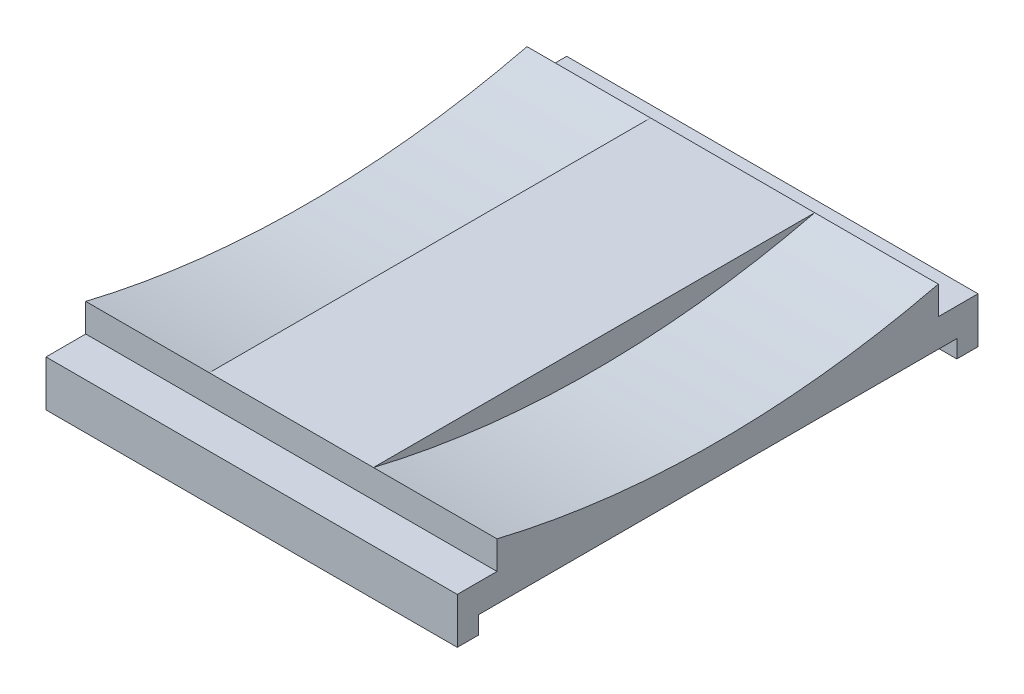
ISO-10303-21;
HEADER;
FILE_DESCRIPTION(('STEP AP214'),'2;1');
FILE_NAME('part.step','',(''),(''),'','','');
FILE_SCHEMA(('AUTOMOTIVE_DESIGN { 1 0 10303 214 1 1 1 1 }'));
ENDSEC;
DATA;
#1=APPLICATION_CONTEXT('core data for automotive mechanical design processes');
#2=APPLICATION_PROTOCOL_DEFINITION('international standard','automotive_design',2000,#1);
#3=PRODUCT_CONTEXT('',#1,'mechanical');
#4=PRODUCT('Part','Part','',(#3));
#5=PRODUCT_RELATED_PRODUCT_CATEGORY('part','',(#4));
#6=PRODUCT_DEFINITION_FORMATION('','',#4);
#7=PRODUCT_DEFINITION_CONTEXT('part definition',#1,'design');
#8=PRODUCT_DEFINITION('design','',#6,#7);
#9=PRODUCT_DEFINITION_SHAPE('','',#8);
#10=(LENGTH_UNIT() NAMED_UNIT(*) SI_UNIT(.MILLI.,.METRE.));
#11=(NAMED_UNIT(*) PLANE_ANGLE_UNIT() SI_UNIT($,.RADIAN.));
#12=(NAMED_UNIT(*) SI_UNIT($,.STERADIAN.) SOLID_ANGLE_UNIT());
#13=UNCERTAINTY_MEASURE_WITH_UNIT(LENGTH_MEASURE(1.E-05),#10,'distance_accuracy_value','');
#14=(GEOMETRIC_REPRESENTATION_CONTEXT(3) GLOBAL_UNCERTAINTY_ASSIGNED_CONTEXT((#13)) GLOBAL_UNIT_ASSIGNED_CONTEXT((#10,
#11,#12)) REPRESENTATION_CONTEXT('',''));
#15=CARTESIAN_POINT('',(0.,0.,0.));
#16=DIRECTION('',(0.,0.,1.));
#17=DIRECTION('',(1.,0.,0.));
#18=AXIS2_PLACEMENT_3D('',#15,#16,#17);
#19=CARTESIAN_POINT('',(23.3,39.2580570397354,30.075137797005));
#20=DIRECTION('',(-1.,0.,0.));
#21=DIRECTION('',(0.,0.,1.));
#22=AXIS2_PLACEMENT_3D('',#19,#20,#21);
#23=CYLINDRICAL_SURFACE('',#22,53.2434327613098);
#24=CARTESIAN_POINT('',(16.3,39.2580570397354,30.075137797005));
#25=DIRECTION('',(1.,0.,0.));
#26=DIRECTION('',(0.,0.,-1.));
#27=AXIS2_PLACEMENT_3D('',#24,#25,#26);
#28=CIRCLE('',#27,53.2434327613098);
#29=CARTESIAN_POINT('',(16.3,-12.4972628047802,42.575137797005));
#30=VERTEX_POINT('',#29);
#31=CARTESIAN_POINT('',(16.3,-12.4972628047802,17.575137797005));
#32=VERTEX_POINT('',#31);
#33=EDGE_CURVE('E434',#30,#32,#28,.T.);
#34=ORIENTED_EDGE('',*,*,#33,.F.);
#35=DIRECTION('',(-1.,0.,0.));
#36=VECTOR('',#35,1.);
#37=CARTESIAN_POINT('',(23.3,-12.4972628047802,42.575137797005));
#38=LINE('',#37,#36);
#39=CARTESIAN_POINT('',(23.3,-12.4972628047802,42.575137797005));
#40=VERTEX_POINT('',#39);
#41=EDGE_CURVE('E11',#40,#30,#38,.T.);
#42=ORIENTED_EDGE('',*,*,#41,.F.);
#43=CARTESIAN_POINT('',(23.3,39.2580570397354,30.075137797005));
#44=DIRECTION('',(1.,0.,0.));
#45=DIRECTION('',(0.,0.,-1.));
#46=AXIS2_PLACEMENT_3D('',#43,#44,#45);
#47=CIRCLE('',#46,53.2434327613098);
#48=CARTESIAN_POINT('',(23.3,-12.4972628047802,17.575137797005));
#49=VERTEX_POINT('',#48);
#50=EDGE_CURVE('E439',#40,#49,#47,.T.);
#51=ORIENTED_EDGE('',*,*,#50,.T.);
#52=DIRECTION('',(-1.,0.,0.));
#53=VECTOR('',#52,1.);
#54=CARTESIAN_POINT('',(23.3,-12.4972628047802,17.575137797005));
#55=LINE('',#54,#53);
#56=EDGE_CURVE('E515',#49,#32,#55,.T.);
#57=ORIENTED_EDGE('',*,*,#56,.T.);
#58=EDGE_LOOP('',(#34,#42,#51,#57));
#59=FACE_BOUND('',#58,.T.);
#60=ADVANCED_FACE('F41',(#59),#23,.F.);
#61=CARTESIAN_POINT('',(6.99999999999997,39.2580570397354,30.075137797005));
#62=DIRECTION('',(-1.,0.,0.));
#63=DIRECTION('',(0.,-1.,0.));
#64=AXIS2_PLACEMENT_3D('',#61,#62,#63);
#65=CIRCLE('',#64,53.2434327613098);
#66=CARTESIAN_POINT('',(7.,-12.4972628047802,17.5751377970049));
#67=VERTEX_POINT('',#66);
#68=CARTESIAN_POINT('',(7.,-12.4972628047802,42.575137797005));
#69=VERTEX_POINT('',#68);
#70=EDGE_CURVE('E420',#67,#69,#65,.T.);
#71=ORIENTED_EDGE('',*,*,#70,.F.);
#72=CARTESIAN_POINT('',(0.,-12.4972628047802,17.575137797005));
#73=VERTEX_POINT('',#72);
#74=EDGE_CURVE('E477',#67,#73,#55,.T.);
#75=ORIENTED_EDGE('',*,*,#74,.T.);
#76=CARTESIAN_POINT('',(0.,39.2580570397354,30.075137797005));
#77=DIRECTION('',(1.,0.,0.));
#78=DIRECTION('',(0.,0.,-1.));
#79=AXIS2_PLACEMENT_3D('',#76,#77,#78);
#80=CIRCLE('',#79,53.2434327613098);
#81=CARTESIAN_POINT('',(0.,-12.4972628047802,42.575137797005));
#82=VERTEX_POINT('',#81);
#83=EDGE_CURVE('E438',#82,#73,#80,.T.);
#84=ORIENTED_EDGE('',*,*,#83,.F.);
#85=EDGE_CURVE('E50',#69,#82,#38,.T.);
#86=ORIENTED_EDGE('',*,*,#85,.F.);
#87=EDGE_LOOP('',(#71,#75,#84,#86));
#88=FACE_BOUND('',#87,.T.);
#89=ADVANCED_FACE('F43',(#88),#23,.F.);
#90=CARTESIAN_POINT('',(23.3,0.,42.575137797005));
#91=DIRECTION('',(0.,0.,1.));
#92=DIRECTION('',(1.,0.,0.));
#93=AXIS2_PLACEMENT_3D('',#90,#91,#92);
#94=PLANE('',#93);
#95=DIRECTION('',(0.,1.,0.));
#96=VECTOR('',#95,1.);
#97=CARTESIAN_POINT('',(0.,0.,42.575137797005));
#98=LINE('',#97,#96);
#99=CARTESIAN_POINT('',(0.,-14.0972628047802,42.575137797005));
#100=VERTEX_POINT('',#99);
#101=EDGE_CURVE('E481',#100,#82,#98,.T.);
#102=ORIENTED_EDGE('',*,*,#101,.F.);
#103=DIRECTION('',(-1.,0.,0.));
#104=VECTOR('',#103,1.);
#105=CARTESIAN_POINT('',(23.3,-14.0972628047802,42.575137797005));
#106=LINE('',#105,#104);
#107=CARTESIAN_POINT('',(23.3,-14.0972628047802,42.575137797005));
#108=VERTEX_POINT('',#107);
#109=EDGE_CURVE('E548',#108,#100,#106,.T.);
#110=ORIENTED_EDGE('',*,*,#109,.F.);
#111=DIRECTION('',(0.,1.,0.));
#112=VECTOR('',#111,1.);
#113=CARTESIAN_POINT('',(23.3,0.,42.575137797005));
#114=LINE('',#113,#112);
#115=EDGE_CURVE('E443',#108,#40,#114,.T.);
#116=ORIENTED_EDGE('',*,*,#115,.T.);
#117=ORIENTED_EDGE('',*,*,#41,.T.);
#118=DIRECTION('',(-1.,0.,0.));
#119=VECTOR('',#118,1.);
#120=CARTESIAN_POINT('',(7.,-12.4972628047802,42.575137797005));
#121=LINE('',#120,#119);
#122=EDGE_CURVE('E417',#30,#69,#121,.T.);
#123=ORIENTED_EDGE('',*,*,#122,.T.);
#124=ORIENTED_EDGE('',*,*,#85,.T.);
#125=EDGE_LOOP('',(#102,#110,#116,#117,#123,#124));
#126=FACE_BOUND('',#125,.T.);
#127=ADVANCED_FACE('F555',(#126),#94,.T.);
#128=CARTESIAN_POINT('',(23.3,-14.0972628047802,0.));
#129=DIRECTION('',(0.,1.,0.));
#130=DIRECTION('',(0.,0.,1.));
#131=AXIS2_PLACEMENT_3D('',#128,#129,#130);
#132=PLANE('',#131);
#133=DIRECTION('',(0.,0.,-1.));
#134=VECTOR('',#133,1.);
#135=CARTESIAN_POINT('',(0.,-14.0972628047802,0.));
#136=LINE('',#135,#134);
#137=CARTESIAN_POINT('',(0.,-14.0972628047802,44.825137797005));
#138=VERTEX_POINT('',#137);
#139=EDGE_CURVE('E485',#138,#100,#136,.T.);
#140=ORIENTED_EDGE('',*,*,#139,.F.);
#141=DIRECTION('',(-1.,0.,0.));
#142=VECTOR('',#141,1.);
#143=CARTESIAN_POINT('',(23.3,-14.0972628047802,44.825137797005));
#144=LINE('',#143,#142);
#145=CARTESIAN_POINT('',(23.3,-14.0972628047802,44.825137797005));
#146=VERTEX_POINT('',#145);
#147=EDGE_CURVE('E546',#146,#138,#144,.T.);
#148=ORIENTED_EDGE('',*,*,#147,.F.);
#149=DIRECTION('',(0.,0.,-1.));
#150=VECTOR('',#149,1.);
#151=CARTESIAN_POINT('',(23.3,-14.0972628047802,0.));
#152=LINE('',#151,#150);
#153=EDGE_CURVE('E448',#146,#108,#152,.T.);
#154=ORIENTED_EDGE('',*,*,#153,.T.);
#155=ORIENTED_EDGE('',*,*,#109,.T.);
#156=EDGE_LOOP('',(#140,#148,#154,#155));
#157=FACE_BOUND('',#156,.T.);
#158=ADVANCED_FACE('F562',(#157),#132,.T.);
#159=CARTESIAN_POINT('',(23.3,0.,44.825137797005));
#160=DIRECTION('',(0.,0.,-1.));
#161=DIRECTION('',(-1.,0.,0.));
#162=AXIS2_PLACEMENT_3D('',#159,#160,#161);
#163=PLANE('',#162);
#164=DIRECTION('',(0.,-1.,0.));
#165=VECTOR('',#164,1.);
#166=CARTESIAN_POINT('',(0.,0.,44.825137797005));
#167=LINE('',#166,#165);
#168=CARTESIAN_POINT('',(0.,-16.6972628047802,44.825137797005));
#169=VERTEX_POINT('',#168);
#170=EDGE_CURVE('E489',#138,#169,#167,.T.);
#171=ORIENTED_EDGE('',*,*,#170,.T.);
#172=DIRECTION('',(-1.,0.,0.));
#173=VECTOR('',#172,1.);
#174=CARTESIAN_POINT('',(23.3,-16.6972628047802,44.825137797005));
#175=LINE('',#174,#173);
#176=CARTESIAN_POINT('',(23.3,-16.6972628047802,44.825137797005));
#177=VERTEX_POINT('',#176);
#178=EDGE_CURVE('E542',#177,#169,#175,.T.);
#179=ORIENTED_EDGE('',*,*,#178,.F.);
#180=DIRECTION('',(0.,-1.,0.));
#181=VECTOR('',#180,1.);
#182=CARTESIAN_POINT('',(23.3,0.,44.825137797005));
#183=LINE('',#182,#181);
#184=EDGE_CURVE('E452',#146,#177,#183,.T.);
#185=ORIENTED_EDGE('',*,*,#184,.F.);
#186=ORIENTED_EDGE('',*,*,#147,.T.);
#187=EDGE_LOOP('',(#171,#179,#185,#186));
#188=FACE_BOUND('',#187,.T.);
#189=ADVANCED_FACE('F567',(#188),#163,.F.);
#190=CARTESIAN_POINT('',(23.3,-16.6972628047802,0.));
#191=DIRECTION('',(0.,1.,0.));
#192=DIRECTION('',(0.,0.,1.));
#193=AXIS2_PLACEMENT_3D('',#190,#191,#192);
#194=PLANE('',#193);
#195=DIRECTION('',(0.,0.,-1.));
#196=VECTOR('',#195,1.);
#197=CARTESIAN_POINT('',(0.,-16.6972628047802,0.));
#198=LINE('',#197,#196);
#199=CARTESIAN_POINT('',(0.,-16.6972628047802,43.625137797005));
#200=VERTEX_POINT('',#199);
#201=EDGE_CURVE('E493',#169,#200,#198,.T.);
#202=ORIENTED_EDGE('',*,*,#201,.T.);
#203=DIRECTION('',(-1.,0.,0.));
#204=VECTOR('',#203,1.);
#205=CARTESIAN_POINT('',(23.3,-16.6972628047802,43.625137797005));
#206=LINE('',#205,#204);
#207=CARTESIAN_POINT('',(23.3,-16.6972628047802,43.625137797005));
#208=VERTEX_POINT('',#207);
#209=EDGE_CURVE('E539',#208,#200,#206,.T.);
#210=ORIENTED_EDGE('',*,*,#209,.F.);
#211=DIRECTION('',(0.,0.,-1.));
#212=VECTOR('',#211,1.);
#213=CARTESIAN_POINT('',(23.3,-16.6972628047802,0.));
#214=LINE('',#213,#212);
#215=EDGE_CURVE('E456',#177,#208,#214,.T.);
#216=ORIENTED_EDGE('',*,*,#215,.F.);
#217=ORIENTED_EDGE('',*,*,#178,.T.);
#218=EDGE_LOOP('',(#202,#210,#216,#217));
#219=FACE_BOUND('',#218,.T.);
#220=ADVANCED_FACE('F612',(#219),#194,.F.);
#221=CARTESIAN_POINT('',(23.3,0.,43.625137797005));
#222=DIRECTION('',(0.,0.,-1.));
#223=DIRECTION('',(-1.,0.,0.));
#224=AXIS2_PLACEMENT_3D('',#221,#222,#223);
#225=PLANE('',#224);
#226=DIRECTION('',(0.,-1.,0.));
#227=VECTOR('',#226,1.);
#228=CARTESIAN_POINT('',(0.,0.,43.625137797005));
#229=LINE('',#228,#227);
#230=CARTESIAN_POINT('',(0.,-15.6972628047802,43.625137797005));
#231=VERTEX_POINT('',#230);
#232=EDGE_CURVE('E497',#231,#200,#229,.T.);
#233=ORIENTED_EDGE('',*,*,#232,.F.);
#234=DIRECTION('',(-1.,0.,0.));
#235=VECTOR('',#234,1.);
#236=CARTESIAN_POINT('',(23.3,-15.6972628047802,43.625137797005));
#237=LINE('',#236,#235);
#238=CARTESIAN_POINT('',(23.3,-15.6972628047802,43.625137797005));
#239=VERTEX_POINT('',#238);
#240=EDGE_CURVE('E536',#239,#231,#237,.T.);
#241=ORIENTED_EDGE('',*,*,#240,.F.);
#242=DIRECTION('',(0.,-1.,0.));
#243=VECTOR('',#242,1.);
#244=CARTESIAN_POINT('',(23.3,0.,43.625137797005));
#245=LINE('',#244,#243);
#246=EDGE_CURVE('E459',#239,#208,#245,.T.);
#247=ORIENTED_EDGE('',*,*,#246,.T.);
#248=ORIENTED_EDGE('',*,*,#209,.T.);
#249=EDGE_LOOP('',(#233,#241,#247,#248));
#250=FACE_BOUND('',#249,.T.);
#251=ADVANCED_FACE('F613',(#250),#225,.T.);
#252=CARTESIAN_POINT('',(23.3,-15.6972628047802,0.));
#253=DIRECTION('',(0.,1.,0.));
#254=DIRECTION('',(0.,0.,1.));
#255=AXIS2_PLACEMENT_3D('',#252,#253,#254);
#256=PLANE('',#255);
#257=DIRECTION('',(1.,0.,0.));
#258=VECTOR('',#257,1.);
#259=CARTESIAN_POINT('',(0.,-15.6972628047802,41.625137797005));
#260=LINE('',#259,#258);
#261=CARTESIAN_POINT('',(4.,-15.6972628047802,41.625137797005));
#262=VERTEX_POINT('',#261);
#263=CARTESIAN_POINT('',(19.3,-15.6972628047802,41.625137797005));
#264=VERTEX_POINT('',#263);
#265=EDGE_CURVE('E57',#262,#264,#260,.T.);
#266=ORIENTED_EDGE('',*,*,#265,.T.);
#267=CARTESIAN_POINT('',(21.3,-15.6972628047802,41.625137797005));
#268=DIRECTION('',(0.,-1.,0.));
#269=DIRECTION('',(0.,0.,-1.));
#270=AXIS2_PLACEMENT_3D('',#267,#268,#269);
#271=CIRCLE('',#270,2.);
#272=CARTESIAN_POINT('',(21.3,-15.6972628047802,39.625137797005));
#273=VERTEX_POINT('',#272);
#274=EDGE_CURVE('E258',#264,#273,#271,.T.);
#275=ORIENTED_EDGE('',*,*,#274,.T.);
#276=DIRECTION('',(0.,0.,-1.));
#277=VECTOR('',#276,1.);
#278=CARTESIAN_POINT('',(21.3,-15.6972628047802,0.));
#279=LINE('',#278,#277);
#280=CARTESIAN_POINT('',(21.3,-15.6972628047802,38.425137797005));
#281=VERTEX_POINT('',#280);
#282=EDGE_CURVE('E365',#273,#281,#279,.T.);
#283=ORIENTED_EDGE('',*,*,#282,.T.);
#284=DIRECTION('',(1.,0.,0.));
#285=VECTOR('',#284,1.);
#286=CARTESIAN_POINT('',(0.,-15.6972628047802,38.425137797005));
#287=LINE('',#286,#285);
#288=CARTESIAN_POINT('',(14.3,-15.6972628047802,38.425137797005));
#289=VERTEX_POINT('',#288);
#290=EDGE_CURVE('E361',#289,#281,#287,.T.);
#291=ORIENTED_EDGE('',*,*,#290,.F.);
#292=DIRECTION('',(0.,0.,-1.));
#293=VECTOR('',#292,1.);
#294=CARTESIAN_POINT('',(14.3,-15.6972628047802,0.));
#295=LINE('',#294,#293);
#296=CARTESIAN_POINT('',(14.3,-15.6972628047802,21.725137797005));
#297=VERTEX_POINT('',#296);
#298=EDGE_CURVE('E357',#289,#297,#295,.T.);
#299=ORIENTED_EDGE('',*,*,#298,.T.);
#300=DIRECTION('',(1.,0.,0.));
#301=VECTOR('',#300,1.);
#302=CARTESIAN_POINT('',(0.,-15.6972628047802,21.725137797005));
#303=LINE('',#302,#301);
#304=CARTESIAN_POINT('',(21.3,-15.6972628047802,21.725137797005));
#305=VERTEX_POINT('',#304);
#306=EDGE_CURVE('E353',#297,#305,#303,.T.);
#307=ORIENTED_EDGE('',*,*,#306,.T.);
#308=DIRECTION('',(0.,0.,1.));
#309=VECTOR('',#308,1.);
#310=CARTESIAN_POINT('',(21.3,-15.6972628047802,0.));
#311=LINE('',#310,#309);
#312=CARTESIAN_POINT('',(21.3,-15.6972628047802,20.525137797005));
#313=VERTEX_POINT('',#312);
#314=EDGE_CURVE('E349',#313,#305,#311,.T.);
#315=ORIENTED_EDGE('',*,*,#314,.F.);
#316=CARTESIAN_POINT('',(21.3,-15.6972628047802,18.525137797005));
#317=DIRECTION('',(0.,-1.,0.));
#318=DIRECTION('',(0.,0.,-1.));
#319=AXIS2_PLACEMENT_3D('',#316,#317,#318);
#320=CIRCLE('',#319,2.00000000000001);
#321=CARTESIAN_POINT('',(19.3,-15.6972628047802,18.525137797005));
#322=VERTEX_POINT('',#321);
#323=EDGE_CURVE('E345',#322,#313,#320,.F.);
#324=ORIENTED_EDGE('',*,*,#323,.F.);
#325=DIRECTION('',(1.,0.,0.));
#326=VECTOR('',#325,1.);
#327=CARTESIAN_POINT('',(0.,-15.6972628047802,18.525137797005));
#328=LINE('',#327,#326);
#329=CARTESIAN_POINT('',(4.,-15.6972628047802,18.525137797005));
#330=VERTEX_POINT('',#329);
#331=EDGE_CURVE('E341',#330,#322,#328,.T.);
#332=ORIENTED_EDGE('',*,*,#331,.F.);
#333=CARTESIAN_POINT('',(1.99999999999999,-15.6972628047802,18.525137797005));
#334=DIRECTION('',(0.,-1.,0.));
#335=DIRECTION('',(0.,0.,-1.));
#336=AXIS2_PLACEMENT_3D('',#333,#334,#335);
#337=CIRCLE('',#336,2.);
#338=CARTESIAN_POINT('',(1.99999999999999,-15.6972628047802,20.525137797005));
#339=VERTEX_POINT('',#338);
#340=EDGE_CURVE('E337',#330,#339,#337,.T.);
#341=ORIENTED_EDGE('',*,*,#340,.T.);
#342=DIRECTION('',(0.,0.,1.));
#343=VECTOR('',#342,1.);
#344=CARTESIAN_POINT('',(2.00000000000001,-15.6972628047802,0.));
#345=LINE('',#344,#343);
#346=CARTESIAN_POINT('',(1.99999999999999,-15.6972628047802,21.725137797005));
#347=VERTEX_POINT('',#346);
#348=EDGE_CURVE('E333',#339,#347,#345,.T.);
#349=ORIENTED_EDGE('',*,*,#348,.T.);
#350=DIRECTION('',(-1.,0.,0.));
#351=VECTOR('',#350,1.);
#352=CARTESIAN_POINT('',(0.,-15.6972628047802,21.725137797005));
#353=LINE('',#352,#351);
#354=CARTESIAN_POINT('',(9.,-15.6972628047802,21.725137797005));
#355=VERTEX_POINT('',#354);
#356=EDGE_CURVE('E329',#355,#347,#353,.T.);
#357=ORIENTED_EDGE('',*,*,#356,.F.);
#358=DIRECTION('',(0.,0.,-1.));
#359=VECTOR('',#358,1.);
#360=CARTESIAN_POINT('',(8.99999999999999,-15.6972628047802,0.));
#361=LINE('',#360,#359);
#362=CARTESIAN_POINT('',(8.99999999999999,-15.6972628047802,38.425137797005));
#363=VERTEX_POINT('',#362);
#364=EDGE_CURVE('E325',#363,#355,#361,.T.);
#365=ORIENTED_EDGE('',*,*,#364,.F.);
#366=DIRECTION('',(-1.,0.,0.));
#367=VECTOR('',#366,1.);
#368=CARTESIAN_POINT('',(0.,-15.6972628047802,38.425137797005));
#369=LINE('',#368,#367);
#370=CARTESIAN_POINT('',(1.99999999999999,-15.6972628047802,38.425137797005));
#371=VERTEX_POINT('',#370);
#372=EDGE_CURVE('E321',#363,#371,#369,.T.);
#373=ORIENTED_EDGE('',*,*,#372,.T.);
#374=DIRECTION('',(0.,0.,-1.));
#375=VECTOR('',#374,1.);
#376=CARTESIAN_POINT('',(1.99999999999995,-15.6972628047802,0.));
#377=LINE('',#376,#375);
#378=CARTESIAN_POINT('',(1.99999999999999,-15.6972628047802,39.625137797005));
#379=VERTEX_POINT('',#378);
#380=EDGE_CURVE('E317',#379,#371,#377,.T.);
#381=ORIENTED_EDGE('',*,*,#380,.F.);
#382=CARTESIAN_POINT('',(1.99999999999999,-15.6972628047802,41.625137797005));
#383=DIRECTION('',(0.,-1.,0.));
#384=DIRECTION('',(0.,0.,-1.));
#385=AXIS2_PLACEMENT_3D('',#382,#383,#384);
#386=CIRCLE('',#385,2.);
#387=EDGE_CURVE('E314',#262,#379,#386,.F.);
#388=ORIENTED_EDGE('',*,*,#387,.F.);
#389=EDGE_LOOP('',(#266,#275,#283,#291,#299,#307,#315,#324,#332,#341,#349,#357,#365,#373,#381,#388));
#390=FACE_BOUND('',#389,.T.);
#391=DIRECTION('',(0.,0.,-1.));
#392=VECTOR('',#391,1.);
#393=CARTESIAN_POINT('',(0.,-15.6972628047802,0.));
#394=LINE('',#393,#392);
#395=CARTESIAN_POINT('',(0.,-15.6972628047802,16.525137797005));
#396=VERTEX_POINT('',#395);
#397=EDGE_CURVE('E502',#231,#396,#394,.T.);
#398=ORIENTED_EDGE('',*,*,#397,.T.);
#399=DIRECTION('',(-1.,0.,0.));
#400=VECTOR('',#399,1.);
#401=CARTESIAN_POINT('',(23.3,-15.6972628047802,16.525137797005));
#402=LINE('',#401,#400);
#403=CARTESIAN_POINT('',(23.3,-15.6972628047802,16.525137797005));
#404=VERTEX_POINT('',#403);
#405=EDGE_CURVE('E532',#404,#396,#402,.T.);
#406=ORIENTED_EDGE('',*,*,#405,.F.);
#407=DIRECTION('',(0.,0.,-1.));
#408=VECTOR('',#407,1.);
#409=CARTESIAN_POINT('',(23.3,-15.6972628047802,0.));
#410=LINE('',#409,#408);
#411=EDGE_CURVE('E464',#239,#404,#410,.T.);
#412=ORIENTED_EDGE('',*,*,#411,.F.);
#413=ORIENTED_EDGE('',*,*,#240,.T.);
#414=EDGE_LOOP('',(#398,#406,#412,#413));
#415=FACE_BOUND('',#414,.T.);
#416=ADVANCED_FACE('F616',(#390,#415),#256,.F.);
#417=CARTESIAN_POINT('',(23.3,0.,16.525137797005));
#418=DIRECTION('',(0.,0.,-1.));
#419=DIRECTION('',(-1.,0.,0.));
#420=AXIS2_PLACEMENT_3D('',#417,#418,#419);
#421=PLANE('',#420);
#422=DIRECTION('',(0.,-1.,0.));
#423=VECTOR('',#422,1.);
#424=CARTESIAN_POINT('',(0.,0.,16.525137797005));
#425=LINE('',#424,#423);
#426=CARTESIAN_POINT('',(0.,-16.6972628047802,16.525137797005));
#427=VERTEX_POINT('',#426);
#428=EDGE_CURVE('E505',#396,#427,#425,.T.);
#429=ORIENTED_EDGE('',*,*,#428,.T.);
#430=DIRECTION('',(-1.,0.,0.));
#431=VECTOR('',#430,1.);
#432=CARTESIAN_POINT('',(23.3,-16.6972628047802,16.525137797005));
#433=LINE('',#432,#431);
#434=CARTESIAN_POINT('',(23.3,-16.6972628047802,16.525137797005));
#435=VERTEX_POINT('',#434);
#436=EDGE_CURVE('E528',#435,#427,#433,.T.);
#437=ORIENTED_EDGE('',*,*,#436,.F.);
#438=DIRECTION('',(0.,-1.,0.));
#439=VECTOR('',#438,1.);
#440=CARTESIAN_POINT('',(23.3,0.,16.525137797005));
#441=LINE('',#440,#439);
#442=EDGE_CURVE('E467',#404,#435,#441,.T.);
#443=ORIENTED_EDGE('',*,*,#442,.F.);
#444=ORIENTED_EDGE('',*,*,#405,.T.);
#445=EDGE_LOOP('',(#429,#437,#443,#444));
#446=FACE_BOUND('',#445,.T.);
#447=ADVANCED_FACE('F620',(#446),#421,.F.);
#448=CARTESIAN_POINT('',(0.,-16.6972628047802,15.325137797005));
#449=VERTEX_POINT('',#448);
#450=EDGE_CURVE('E498',#427,#449,#198,.T.);
#451=ORIENTED_EDGE('',*,*,#450,.T.);
#452=DIRECTION('',(-1.,0.,0.));
#453=VECTOR('',#452,1.);
#454=CARTESIAN_POINT('',(23.3,-16.6972628047802,15.325137797005));
#455=LINE('',#454,#453);
#456=CARTESIAN_POINT('',(23.3,-16.6972628047802,15.325137797005));
#457=VERTEX_POINT('',#456);
#458=EDGE_CURVE('E525',#457,#449,#455,.T.);
#459=ORIENTED_EDGE('',*,*,#458,.F.);
#460=EDGE_CURVE('E460',#435,#457,#214,.T.);
#461=ORIENTED_EDGE('',*,*,#460,.F.);
#462=ORIENTED_EDGE('',*,*,#436,.T.);
#463=EDGE_LOOP('',(#451,#459,#461,#462));
#464=FACE_BOUND('',#463,.T.);
#465=ADVANCED_FACE('F624',(#464),#194,.F.);
#466=CARTESIAN_POINT('',(23.3,0.,15.325137797005));
#467=DIRECTION('',(0.,0.,-1.));
#468=DIRECTION('',(-1.,0.,0.));
#469=AXIS2_PLACEMENT_3D('',#466,#467,#468);
#470=PLANE('',#469);
#471=DIRECTION('',(0.,-1.,0.));
#472=VECTOR('',#471,1.);
#473=CARTESIAN_POINT('',(0.,0.,15.325137797005));
#474=LINE('',#473,#472);
#475=CARTESIAN_POINT('',(0.,-14.0972628047802,15.325137797005));
#476=VERTEX_POINT('',#475);
#477=EDGE_CURVE('E508',#476,#449,#474,.T.);
#478=ORIENTED_EDGE('',*,*,#477,.F.);
#479=DIRECTION('',(-1.,0.,0.));
#480=VECTOR('',#479,1.);
#481=CARTESIAN_POINT('',(23.3,-14.0972628047802,15.325137797005));
#482=LINE('',#481,#480);
#483=CARTESIAN_POINT('',(23.3,-14.0972628047802,15.325137797005));
#484=VERTEX_POINT('',#483);
#485=EDGE_CURVE('E522',#484,#476,#482,.T.);
#486=ORIENTED_EDGE('',*,*,#485,.F.);
#487=DIRECTION('',(0.,-1.,0.));
#488=VECTOR('',#487,1.);
#489=CARTESIAN_POINT('',(23.3,0.,15.325137797005));
#490=LINE('',#489,#488);
#491=EDGE_CURVE('E470',#484,#457,#490,.T.);
#492=ORIENTED_EDGE('',*,*,#491,.T.);
#493=ORIENTED_EDGE('',*,*,#458,.T.);
#494=EDGE_LOOP('',(#478,#486,#492,#493));
#495=FACE_BOUND('',#494,.T.);
#496=ADVANCED_FACE('F628',(#495),#470,.T.);
#497=CARTESIAN_POINT('',(0.,-14.0972628047802,17.575137797005));
#498=VERTEX_POINT('',#497);
#499=EDGE_CURVE('E490',#498,#476,#136,.T.);
#500=ORIENTED_EDGE('',*,*,#499,.F.);
#501=DIRECTION('',(-1.,0.,0.));
#502=VECTOR('',#501,1.);
#503=CARTESIAN_POINT('',(23.3,-14.0972628047802,17.575137797005));
#504=LINE('',#503,#502);
#505=CARTESIAN_POINT('',(23.3,-14.0972628047802,17.575137797005));
#506=VERTEX_POINT('',#505);
#507=EDGE_CURVE('E519',#506,#498,#504,.T.);
#508=ORIENTED_EDGE('',*,*,#507,.F.);
#509=EDGE_CURVE('E453',#506,#484,#152,.T.);
#510=ORIENTED_EDGE('',*,*,#509,.T.);
#511=ORIENTED_EDGE('',*,*,#485,.T.);
#512=EDGE_LOOP('',(#500,#508,#510,#511));
#513=FACE_BOUND('',#512,.T.);
#514=ADVANCED_FACE('F608',(#513),#132,.T.);
#515=CARTESIAN_POINT('',(23.3,0.,17.575137797005));
#516=DIRECTION('',(0.,0.,1.));
#517=DIRECTION('',(0.,-1.,0.));
#518=AXIS2_PLACEMENT_3D('',#515,#516,#517);
#519=PLANE('',#518);
#520=ORIENTED_EDGE('',*,*,#74,.F.);
#521=DIRECTION('',(-1.,0.,0.));
#522=VECTOR('',#521,1.);
#523=CARTESIAN_POINT('',(23.3,-12.4972628047802,17.5751377970049));
#524=LINE('',#523,#522);
#525=EDGE_CURVE('E375',#67,#32,#524,.F.);
#526=ORIENTED_EDGE('',*,*,#525,.T.);
#527=ORIENTED_EDGE('',*,*,#56,.F.);
#528=DIRECTION('',(0.,1.,0.));
#529=VECTOR('',#528,1.);
#530=CARTESIAN_POINT('',(23.3,0.,17.575137797005));
#531=LINE('',#530,#529);
#532=EDGE_CURVE('E474',#506,#49,#531,.T.);
#533=ORIENTED_EDGE('',*,*,#532,.F.);
#534=ORIENTED_EDGE('',*,*,#507,.T.);
#535=DIRECTION('',(0.,1.,0.));
#536=VECTOR('',#535,1.);
#537=CARTESIAN_POINT('',(0.,0.,17.575137797005));
#538=LINE('',#537,#536);
#539=EDGE_CURVE('E444',#498,#73,#538,.T.);
#540=ORIENTED_EDGE('',*,*,#539,.T.);
#541=EDGE_LOOP('',(#520,#526,#527,#533,#534,#540));
#542=FACE_BOUND('',#541,.T.);
#543=ADVANCED_FACE('F584',(#542),#519,.F.);
#544=CARTESIAN_POINT('',(23.3,0.,0.));
#545=DIRECTION('',(1.,0.,0.));
#546=DIRECTION('',(0.,0.,-1.));
#547=AXIS2_PLACEMENT_3D('',#544,#545,#546);
#548=PLANE('',#547);
#549=ORIENTED_EDGE('',*,*,#50,.F.);
#550=ORIENTED_EDGE('',*,*,#115,.F.);
#551=ORIENTED_EDGE('',*,*,#153,.F.);
#552=ORIENTED_EDGE('',*,*,#184,.T.);
#553=ORIENTED_EDGE('',*,*,#215,.T.);
#554=ORIENTED_EDGE('',*,*,#246,.F.);
#555=ORIENTED_EDGE('',*,*,#411,.T.);
#556=ORIENTED_EDGE('',*,*,#442,.T.);
#557=ORIENTED_EDGE('',*,*,#460,.T.);
#558=ORIENTED_EDGE('',*,*,#491,.F.);
#559=ORIENTED_EDGE('',*,*,#509,.F.);
#560=ORIENTED_EDGE('',*,*,#532,.T.);
#561=EDGE_LOOP('',(#549,#550,#551,#552,#553,#554,#555,#556,#557,#558,#559,#560));
#562=FACE_BOUND('',#561,.T.);
#563=ADVANCED_FACE('F572',(#562),#548,.T.);
#564=CARTESIAN_POINT('',(0.,0.,0.));
#565=DIRECTION('',(1.,0.,0.));
#566=DIRECTION('',(0.,0.,-1.));
#567=AXIS2_PLACEMENT_3D('',#564,#565,#566);
#568=PLANE('',#567);
#569=ORIENTED_EDGE('',*,*,#83,.T.);
#570=ORIENTED_EDGE('',*,*,#539,.F.);
#571=ORIENTED_EDGE('',*,*,#499,.T.);
#572=ORIENTED_EDGE('',*,*,#477,.T.);
#573=ORIENTED_EDGE('',*,*,#450,.F.);
#574=ORIENTED_EDGE('',*,*,#428,.F.);
#575=ORIENTED_EDGE('',*,*,#397,.F.);
#576=ORIENTED_EDGE('',*,*,#232,.T.);
#577=ORIENTED_EDGE('',*,*,#201,.F.);
#578=ORIENTED_EDGE('',*,*,#170,.F.);
#579=ORIENTED_EDGE('',*,*,#139,.T.);
#580=ORIENTED_EDGE('',*,*,#101,.T.);
#581=EDGE_LOOP('',(#569,#570,#571,#572,#573,#574,#575,#576,#577,#578,#579,#580));
#582=FACE_BOUND('',#581,.T.);
#583=ADVANCED_FACE('F559',(#582),#568,.F.);
#584=CARTESIAN_POINT('',(16.3,-12.4972628047802,15.323137797005));
#585=DIRECTION('',(1.,0.,0.));
#586=DIRECTION('',(0.,0.,-1.));
#587=AXIS2_PLACEMENT_3D('',#584,#585,#586);
#588=PLANE('',#587);
#589=DIRECTION('',(0.,0.,1.));
#590=VECTOR('',#589,1.);
#591=CARTESIAN_POINT('',(16.3,-12.4972628047802,15.323137797005));
#592=LINE('',#591,#590);
#593=EDGE_CURVE('E424',#32,#30,#592,.T.);
#594=ORIENTED_EDGE('',*,*,#593,.T.);
#595=ORIENTED_EDGE('',*,*,#33,.T.);
#596=EDGE_LOOP('',(#594,#595));
#597=FACE_BOUND('',#596,.T.);
#598=ADVANCED_FACE('F580',(#597),#588,.T.);
#599=CARTESIAN_POINT('',(7.,-12.4972628047802,15.323137797005));
#600=DIRECTION('',(-1.,0.,0.));
#601=DIRECTION('',(0.,-1.,0.));
#602=AXIS2_PLACEMENT_3D('',#599,#600,#601);
#603=PLANE('',#602);
#604=DIRECTION('',(0.,0.,1.));
#605=VECTOR('',#604,1.);
#606=CARTESIAN_POINT('',(7.,-12.4972628047802,15.323137797005));
#607=LINE('',#606,#605);
#608=EDGE_CURVE('E421',#67,#69,#607,.T.);
#609=ORIENTED_EDGE('',*,*,#608,.F.);
#610=ORIENTED_EDGE('',*,*,#70,.T.);
#611=EDGE_LOOP('',(#609,#610));
#612=FACE_BOUND('',#611,.T.);
#613=ADVANCED_FACE('F588',(#612),#603,.T.);
#614=CARTESIAN_POINT('',(7.,-12.4972628047802,15.323137797005));
#615=DIRECTION('',(0.,1.,0.));
#616=DIRECTION('',(0.,0.,1.));
#617=AXIS2_PLACEMENT_3D('',#614,#615,#616);
#618=PLANE('',#617);
#619=ORIENTED_EDGE('',*,*,#525,.F.);
#620=ORIENTED_EDGE('',*,*,#608,.T.);
#621=ORIENTED_EDGE('',*,*,#122,.F.);
#622=ORIENTED_EDGE('',*,*,#593,.F.);
#623=EDGE_LOOP('',(#619,#620,#621,#622));
#624=FACE_BOUND('',#623,.T.);
#625=ADVANCED_FACE('F577',(#624),#618,.T.);
#626=CARTESIAN_POINT('',(0.,-14.0972628047802,41.625137797005));
#627=DIRECTION('',(0.,0.,-1.));
#628=DIRECTION('',(-1.,0.,0.));
#629=AXIS2_PLACEMENT_3D('',#626,#627,#628);
#630=PLANE('',#629);
#631=ORIENTED_EDGE('',*,*,#265,.F.);
#632=DIRECTION('',(0.,-1.,0.));
#633=VECTOR('',#632,1.);
#634=CARTESIAN_POINT('',(4.,-14.0972628047802,41.625137797005));
#635=LINE('',#634,#633);
#636=CARTESIAN_POINT('',(4.,-14.0972628047802,41.625137797005));
#637=VERTEX_POINT('',#636);
#638=EDGE_CURVE('E238',#637,#262,#635,.T.);
#639=ORIENTED_EDGE('',*,*,#638,.F.);
#640=DIRECTION('',(1.,0.,0.));
#641=VECTOR('',#640,1.);
#642=CARTESIAN_POINT('',(0.,-14.0972628047802,41.625137797005));
#643=LINE('',#642,#641);
#644=CARTESIAN_POINT('',(19.3,-14.0972628047802,41.625137797005));
#645=VERTEX_POINT('',#644);
#646=EDGE_CURVE('E241',#637,#645,#643,.T.);
#647=ORIENTED_EDGE('',*,*,#646,.T.);
#648=DIRECTION('',(0.,-1.,0.));
#649=VECTOR('',#648,1.);
#650=CARTESIAN_POINT('',(19.3,-14.0972628047802,41.625137797005));
#651=LINE('',#650,#649);
#652=EDGE_CURVE('E372',#645,#264,#651,.T.);
#653=ORIENTED_EDGE('',*,*,#652,.T.);
#654=EDGE_LOOP('',(#631,#639,#647,#653));
#655=FACE_BOUND('',#654,.T.);
#656=ADVANCED_FACE('F240',(#655),#630,.T.);
#657=CARTESIAN_POINT('',(21.3,-14.0972628047802,41.625137797005));
#658=DIRECTION('',(0.,-1.,0.));
#659=DIRECTION('',(0.,0.,-1.));
#660=AXIS2_PLACEMENT_3D('',#657,#658,#659);
#661=CYLINDRICAL_SURFACE('',#660,2.);
#662=ORIENTED_EDGE('',*,*,#274,.F.);
#663=ORIENTED_EDGE('',*,*,#652,.F.);
#664=CARTESIAN_POINT('',(21.3,-14.0972628047802,41.625137797005));
#665=DIRECTION('',(0.,-1.,0.));
#666=DIRECTION('',(0.,0.,-1.));
#667=AXIS2_PLACEMENT_3D('',#664,#665,#666);
#668=CIRCLE('',#667,2.);
#669=CARTESIAN_POINT('',(21.3,-14.0972628047802,39.625137797005));
#670=VERTEX_POINT('',#669);
#671=EDGE_CURVE('E249',#645,#670,#668,.T.);
#672=ORIENTED_EDGE('',*,*,#671,.T.);
#673=DIRECTION('',(0.,-1.,0.));
#674=VECTOR('',#673,1.);
#675=CARTESIAN_POINT('',(21.3,-14.0972628047802,39.625137797005));
#676=LINE('',#675,#674);
#677=EDGE_CURVE('E376',#670,#273,#676,.T.);
#678=ORIENTED_EDGE('',*,*,#677,.T.);
#679=EDGE_LOOP('',(#662,#663,#672,#678));
#680=FACE_BOUND('',#679,.T.);
#681=ADVANCED_FACE('F685',(#680),#661,.T.);
#682=CARTESIAN_POINT('',(21.3,-14.0972628047802,0.));
#683=DIRECTION('',(-1.,0.,0.));
#684=DIRECTION('',(0.,0.,1.));
#685=AXIS2_PLACEMENT_3D('',#682,#683,#684);
#686=PLANE('',#685);
#687=ORIENTED_EDGE('',*,*,#282,.F.);
#688=ORIENTED_EDGE('',*,*,#677,.F.);
#689=DIRECTION('',(0.,0.,-1.));
#690=VECTOR('',#689,1.);
#691=CARTESIAN_POINT('',(21.3,-14.0972628047802,0.));
#692=LINE('',#691,#690);
#693=CARTESIAN_POINT('',(21.3,-14.0972628047802,38.425137797005));
#694=VERTEX_POINT('',#693);
#695=EDGE_CURVE('E307',#670,#694,#692,.T.);
#696=ORIENTED_EDGE('',*,*,#695,.T.);
#697=DIRECTION('',(0.,-1.,0.));
#698=VECTOR('',#697,1.);
#699=CARTESIAN_POINT('',(21.3,-14.0972628047802,38.425137797005));
#700=LINE('',#699,#698);
#701=EDGE_CURVE('E379',#694,#281,#700,.T.);
#702=ORIENTED_EDGE('',*,*,#701,.T.);
#703=EDGE_LOOP('',(#687,#688,#696,#702));
#704=FACE_BOUND('',#703,.T.);
#705=ADVANCED_FACE('F695',(#704),#686,.T.);
#706=CARTESIAN_POINT('',(0.,-14.0972628047802,38.425137797005));
#707=DIRECTION('',(0.,0.,-1.));
#708=DIRECTION('',(-1.,0.,0.));
#709=AXIS2_PLACEMENT_3D('',#706,#707,#708);
#710=PLANE('',#709);
#711=ORIENTED_EDGE('',*,*,#290,.T.);
#712=ORIENTED_EDGE('',*,*,#701,.F.);
#713=DIRECTION('',(1.,0.,0.));
#714=VECTOR('',#713,1.);
#715=CARTESIAN_POINT('',(0.,-14.0972628047802,38.425137797005));
#716=LINE('',#715,#714);
#717=CARTESIAN_POINT('',(14.3,-14.0972628047802,38.425137797005));
#718=VERTEX_POINT('',#717);
#719=EDGE_CURVE('E303',#718,#694,#716,.T.);
#720=ORIENTED_EDGE('',*,*,#719,.F.);
#721=DIRECTION('',(0.,-1.,0.));
#722=VECTOR('',#721,1.);
#723=CARTESIAN_POINT('',(14.3,-14.0972628047802,38.425137797005));
#724=LINE('',#723,#722);
#725=EDGE_CURVE('E382',#718,#289,#724,.T.);
#726=ORIENTED_EDGE('',*,*,#725,.T.);
#727=EDGE_LOOP('',(#711,#712,#720,#726));
#728=FACE_BOUND('',#727,.T.);
#729=ADVANCED_FACE('F706',(#728),#710,.F.);
#730=CARTESIAN_POINT('',(14.3,-14.0972628047802,0.));
#731=DIRECTION('',(-1.,0.,0.));
#732=DIRECTION('',(0.,0.,1.));
#733=AXIS2_PLACEMENT_3D('',#730,#731,#732);
#734=PLANE('',#733);
#735=ORIENTED_EDGE('',*,*,#298,.F.);
#736=ORIENTED_EDGE('',*,*,#725,.F.);
#737=DIRECTION('',(0.,0.,-1.));
#738=VECTOR('',#737,1.);
#739=CARTESIAN_POINT('',(14.3,-14.0972628047802,0.));
#740=LINE('',#739,#738);
#741=CARTESIAN_POINT('',(14.3,-14.0972628047802,21.725137797005));
#742=VERTEX_POINT('',#741);
#743=EDGE_CURVE('E300',#718,#742,#740,.T.);
#744=ORIENTED_EDGE('',*,*,#743,.T.);
#745=DIRECTION('',(0.,-1.,0.));
#746=VECTOR('',#745,1.);
#747=CARTESIAN_POINT('',(14.3,-14.0972628047802,21.725137797005));
#748=LINE('',#747,#746);
#749=EDGE_CURVE('E385',#742,#297,#748,.T.);
#750=ORIENTED_EDGE('',*,*,#749,.T.);
#751=EDGE_LOOP('',(#735,#736,#744,#750));
#752=FACE_BOUND('',#751,.T.);
#753=ADVANCED_FACE('F716',(#752),#734,.T.);
#754=CARTESIAN_POINT('',(0.,-14.0972628047802,21.725137797005));
#755=DIRECTION('',(0.,0.,-1.));
#756=DIRECTION('',(-1.,0.,0.));
#757=AXIS2_PLACEMENT_3D('',#754,#755,#756);
#758=PLANE('',#757);
#759=ORIENTED_EDGE('',*,*,#306,.F.);
#760=ORIENTED_EDGE('',*,*,#749,.F.);
#761=DIRECTION('',(1.,0.,0.));
#762=VECTOR('',#761,1.);
#763=CARTESIAN_POINT('',(0.,-14.0972628047802,21.725137797005));
#764=LINE('',#763,#762);
#765=CARTESIAN_POINT('',(21.3,-14.0972628047802,21.725137797005));
#766=VERTEX_POINT('',#765);
#767=EDGE_CURVE('E297',#742,#766,#764,.T.);
#768=ORIENTED_EDGE('',*,*,#767,.T.);
#769=DIRECTION('',(0.,-1.,0.));
#770=VECTOR('',#769,1.);
#771=CARTESIAN_POINT('',(21.3,-14.0972628047802,21.725137797005));
#772=LINE('',#771,#770);
#773=EDGE_CURVE('E388',#766,#305,#772,.T.);
#774=ORIENTED_EDGE('',*,*,#773,.T.);
#775=EDGE_LOOP('',(#759,#760,#768,#774));
#776=FACE_BOUND('',#775,.T.);
#777=ADVANCED_FACE('F727',(#776),#758,.T.);
#778=CARTESIAN_POINT('',(21.3,-14.0972628047802,0.));
#779=DIRECTION('',(1.,0.,0.));
#780=DIRECTION('',(0.,0.,-1.));
#781=AXIS2_PLACEMENT_3D('',#778,#779,#780);
#782=PLANE('',#781);
#783=ORIENTED_EDGE('',*,*,#314,.T.);
#784=ORIENTED_EDGE('',*,*,#773,.F.);
#785=DIRECTION('',(0.,0.,1.));
#786=VECTOR('',#785,1.);
#787=CARTESIAN_POINT('',(21.3,-14.0972628047802,0.));
#788=LINE('',#787,#786);
#789=CARTESIAN_POINT('',(21.3,-14.0972628047802,20.525137797005));
#790=VERTEX_POINT('',#789);
#791=EDGE_CURVE('E293',#790,#766,#788,.T.);
#792=ORIENTED_EDGE('',*,*,#791,.F.);
#793=DIRECTION('',(0.,-1.,0.));
#794=VECTOR('',#793,1.);
#795=CARTESIAN_POINT('',(21.3,-14.0972628047802,20.525137797005));
#796=LINE('',#795,#794);
#797=EDGE_CURVE('E391',#790,#313,#796,.T.);
#798=ORIENTED_EDGE('',*,*,#797,.T.);
#799=EDGE_LOOP('',(#783,#784,#792,#798));
#800=FACE_BOUND('',#799,.T.);
#801=ADVANCED_FACE('F738',(#800),#782,.F.);
#802=CARTESIAN_POINT('',(21.3,-14.0972628047802,18.525137797005));
#803=DIRECTION('',(0.,-1.,0.));
#804=DIRECTION('',(0.,0.,-1.));
#805=AXIS2_PLACEMENT_3D('',#802,#803,#804);
#806=CYLINDRICAL_SURFACE('',#805,2.00000000000001);
#807=ORIENTED_EDGE('',*,*,#323,.T.);
#808=ORIENTED_EDGE('',*,*,#797,.F.);
#809=CARTESIAN_POINT('',(21.3,-14.0972628047802,18.525137797005));
#810=DIRECTION('',(0.,-1.,0.));
#811=DIRECTION('',(0.,0.,-1.));
#812=AXIS2_PLACEMENT_3D('',#809,#810,#811);
#813=CIRCLE('',#812,2.00000000000001);
#814=CARTESIAN_POINT('',(19.3,-14.0972628047802,18.525137797005));
#815=VERTEX_POINT('',#814);
#816=EDGE_CURVE('E289',#815,#790,#813,.F.);
#817=ORIENTED_EDGE('',*,*,#816,.F.);
#818=DIRECTION('',(0.,-1.,0.));
#819=VECTOR('',#818,1.);
#820=CARTESIAN_POINT('',(19.3,-14.0972628047802,18.525137797005));
#821=LINE('',#820,#819);
#822=EDGE_CURVE('E394',#815,#322,#821,.T.);
#823=ORIENTED_EDGE('',*,*,#822,.T.);
#824=EDGE_LOOP('',(#807,#808,#817,#823));
#825=FACE_BOUND('',#824,.T.);
#826=ADVANCED_FACE('F748',(#825),#806,.T.);
#827=CARTESIAN_POINT('',(0.,-14.0972628047802,18.525137797005));
#828=DIRECTION('',(0.,0.,-1.));
#829=DIRECTION('',(-1.,0.,0.));
#830=AXIS2_PLACEMENT_3D('',#827,#828,#829);
#831=PLANE('',#830);
#832=ORIENTED_EDGE('',*,*,#331,.T.);
#833=ORIENTED_EDGE('',*,*,#822,.F.);
#834=DIRECTION('',(1.,0.,0.));
#835=VECTOR('',#834,1.);
#836=CARTESIAN_POINT('',(0.,-14.0972628047802,18.525137797005));
#837=LINE('',#836,#835);
#838=CARTESIAN_POINT('',(4.,-14.0972628047802,18.525137797005));
#839=VERTEX_POINT('',#838);
#840=EDGE_CURVE('E285',#839,#815,#837,.T.);
#841=ORIENTED_EDGE('',*,*,#840,.F.);
#842=DIRECTION('',(0.,-1.,0.));
#843=VECTOR('',#842,1.);
#844=CARTESIAN_POINT('',(4.,-14.0972628047802,18.525137797005));
#845=LINE('',#844,#843);
#846=EDGE_CURVE('E397',#839,#330,#845,.T.);
#847=ORIENTED_EDGE('',*,*,#846,.T.);
#848=EDGE_LOOP('',(#832,#833,#841,#847));
#849=FACE_BOUND('',#848,.T.);
#850=ADVANCED_FACE('F758',(#849),#831,.F.);
#851=CARTESIAN_POINT('',(1.99999999999999,-14.0972628047802,18.525137797005));
#852=DIRECTION('',(0.,-1.,0.));
#853=DIRECTION('',(0.,0.,-1.));
#854=AXIS2_PLACEMENT_3D('',#851,#852,#853);
#855=CYLINDRICAL_SURFACE('',#854,2.);
#856=ORIENTED_EDGE('',*,*,#340,.F.);
#857=ORIENTED_EDGE('',*,*,#846,.F.);
#858=CARTESIAN_POINT('',(1.99999999999999,-14.0972628047802,18.525137797005));
#859=DIRECTION('',(0.,-1.,0.));
#860=DIRECTION('',(0.,0.,-1.));
#861=AXIS2_PLACEMENT_3D('',#858,#859,#860);
#862=CIRCLE('',#861,2.);
#863=CARTESIAN_POINT('',(1.99999999999999,-14.0972628047802,20.525137797005));
#864=VERTEX_POINT('',#863);
#865=EDGE_CURVE('E282',#839,#864,#862,.T.);
#866=ORIENTED_EDGE('',*,*,#865,.T.);
#867=DIRECTION('',(0.,-1.,0.));
#868=VECTOR('',#867,1.);
#869=CARTESIAN_POINT('',(1.99999999999999,-14.0972628047802,20.525137797005));
#870=LINE('',#869,#868);
#871=EDGE_CURVE('E400',#864,#339,#870,.T.);
#872=ORIENTED_EDGE('',*,*,#871,.T.);
#873=EDGE_LOOP('',(#856,#857,#866,#872));
#874=FACE_BOUND('',#873,.T.);
#875=ADVANCED_FACE('F769',(#874),#855,.T.);
#876=CARTESIAN_POINT('',(2.00000000000001,-14.0972628047802,0.));
#877=DIRECTION('',(1.,0.,0.));
#878=DIRECTION('',(0.,0.,-1.));
#879=AXIS2_PLACEMENT_3D('',#876,#877,#878);
#880=PLANE('',#879);
#881=ORIENTED_EDGE('',*,*,#348,.F.);
#882=ORIENTED_EDGE('',*,*,#871,.F.);
#883=DIRECTION('',(0.,0.,1.));
#884=VECTOR('',#883,1.);
#885=CARTESIAN_POINT('',(2.00000000000001,-14.0972628047802,0.));
#886=LINE('',#885,#884);
#887=CARTESIAN_POINT('',(1.99999999999999,-14.0972628047802,21.725137797005));
#888=VERTEX_POINT('',#887);
#889=EDGE_CURVE('E279',#864,#888,#886,.T.);
#890=ORIENTED_EDGE('',*,*,#889,.T.);
#891=DIRECTION('',(0.,-1.,0.));
#892=VECTOR('',#891,1.);
#893=CARTESIAN_POINT('',(1.99999999999999,-14.0972628047802,21.725137797005));
#894=LINE('',#893,#892);
#895=EDGE_CURVE('E403',#888,#347,#894,.T.);
#896=ORIENTED_EDGE('',*,*,#895,.T.);
#897=EDGE_LOOP('',(#881,#882,#890,#896));
#898=FACE_BOUND('',#897,.T.);
#899=ADVANCED_FACE('F780',(#898),#880,.T.);
#900=CARTESIAN_POINT('',(0.,-14.0972628047802,21.725137797005));
#901=DIRECTION('',(0.,0.,1.));
#902=DIRECTION('',(1.,0.,0.));
#903=AXIS2_PLACEMENT_3D('',#900,#901,#902);
#904=PLANE('',#903);
#905=ORIENTED_EDGE('',*,*,#356,.T.);
#906=ORIENTED_EDGE('',*,*,#895,.F.);
#907=DIRECTION('',(-1.,0.,0.));
#908=VECTOR('',#907,1.);
#909=CARTESIAN_POINT('',(0.,-14.0972628047802,21.725137797005));
#910=LINE('',#909,#908);
#911=CARTESIAN_POINT('',(9.,-14.0972628047802,21.725137797005));
#912=VERTEX_POINT('',#911);
#913=EDGE_CURVE('E275',#912,#888,#910,.T.);
#914=ORIENTED_EDGE('',*,*,#913,.F.);
#915=DIRECTION('',(0.,-1.,0.));
#916=VECTOR('',#915,1.);
#917=CARTESIAN_POINT('',(9.,-14.0972628047802,21.725137797005));
#918=LINE('',#917,#916);
#919=EDGE_CURVE('E406',#912,#355,#918,.T.);
#920=ORIENTED_EDGE('',*,*,#919,.T.);
#921=EDGE_LOOP('',(#905,#906,#914,#920));
#922=FACE_BOUND('',#921,.T.);
#923=ADVANCED_FACE('F790',(#922),#904,.F.);
#924=CARTESIAN_POINT('',(8.99999999999999,-14.0972628047802,0.));
#925=DIRECTION('',(-1.,0.,0.));
#926=DIRECTION('',(0.,0.,1.));
#927=AXIS2_PLACEMENT_3D('',#924,#925,#926);
#928=PLANE('',#927);
#929=ORIENTED_EDGE('',*,*,#364,.T.);
#930=ORIENTED_EDGE('',*,*,#919,.F.);
#931=DIRECTION('',(0.,0.,-1.));
#932=VECTOR('',#931,1.);
#933=CARTESIAN_POINT('',(8.99999999999999,-14.0972628047802,0.));
#934=LINE('',#933,#932);
#935=CARTESIAN_POINT('',(8.99999999999999,-14.0972628047802,38.425137797005));
#936=VERTEX_POINT('',#935);
#937=EDGE_CURVE('E271',#936,#912,#934,.T.);
#938=ORIENTED_EDGE('',*,*,#937,.F.);
#939=DIRECTION('',(0.,-1.,0.));
#940=VECTOR('',#939,1.);
#941=CARTESIAN_POINT('',(8.99999999999999,-14.0972628047802,38.425137797005));
#942=LINE('',#941,#940);
#943=EDGE_CURVE('E409',#936,#363,#942,.T.);
#944=ORIENTED_EDGE('',*,*,#943,.T.);
#945=EDGE_LOOP('',(#929,#930,#938,#944));
#946=FACE_BOUND('',#945,.T.);
#947=ADVANCED_FACE('F800',(#946),#928,.F.);
#948=CARTESIAN_POINT('',(0.,-14.0972628047802,38.425137797005));
#949=DIRECTION('',(0.,0.,1.));
#950=DIRECTION('',(1.,0.,0.));
#951=AXIS2_PLACEMENT_3D('',#948,#949,#950);
#952=PLANE('',#951);
#953=ORIENTED_EDGE('',*,*,#372,.F.);
#954=ORIENTED_EDGE('',*,*,#943,.F.);
#955=DIRECTION('',(-1.,0.,0.));
#956=VECTOR('',#955,1.);
#957=CARTESIAN_POINT('',(0.,-14.0972628047802,38.425137797005));
#958=LINE('',#957,#956);
#959=CARTESIAN_POINT('',(1.99999999999999,-14.0972628047802,38.425137797005));
#960=VERTEX_POINT('',#959);
#961=EDGE_CURVE('E266',#936,#960,#958,.T.);
#962=ORIENTED_EDGE('',*,*,#961,.T.);
#963=DIRECTION('',(0.,-1.,0.));
#964=VECTOR('',#963,1.);
#965=CARTESIAN_POINT('',(1.99999999999999,-14.0972628047802,38.425137797005));
#966=LINE('',#965,#964);
#967=EDGE_CURVE('E412',#960,#371,#966,.T.);
#968=ORIENTED_EDGE('',*,*,#967,.T.);
#969=EDGE_LOOP('',(#953,#954,#962,#968));
#970=FACE_BOUND('',#969,.T.);
#971=ADVANCED_FACE('F811',(#970),#952,.T.);
#972=CARTESIAN_POINT('',(1.99999999999995,-14.0972628047802,0.));
#973=DIRECTION('',(-1.,0.,0.));
#974=DIRECTION('',(0.,0.,1.));
#975=AXIS2_PLACEMENT_3D('',#972,#973,#974);
#976=PLANE('',#975);
#977=ORIENTED_EDGE('',*,*,#380,.T.);
#978=ORIENTED_EDGE('',*,*,#967,.F.);
#979=DIRECTION('',(0.,0.,-1.));
#980=VECTOR('',#979,1.);
#981=CARTESIAN_POINT('',(1.99999999999995,-14.0972628047802,0.));
#982=LINE('',#981,#980);
#983=CARTESIAN_POINT('',(1.99999999999999,-14.0972628047802,39.625137797005));
#984=VERTEX_POINT('',#983);
#985=EDGE_CURVE('E263',#984,#960,#982,.T.);
#986=ORIENTED_EDGE('',*,*,#985,.F.);
#987=DIRECTION('',(0.,-1.,0.));
#988=VECTOR('',#987,1.);
#989=CARTESIAN_POINT('',(1.99999999999999,-14.0972628047802,39.625137797005));
#990=LINE('',#989,#988);
#991=EDGE_CURVE('E248',#984,#379,#990,.T.);
#992=ORIENTED_EDGE('',*,*,#991,.T.);
#993=EDGE_LOOP('',(#977,#978,#986,#992));
#994=FACE_BOUND('',#993,.T.);
#995=ADVANCED_FACE('F822',(#994),#976,.F.);
#996=CARTESIAN_POINT('',(1.99999999999999,-14.0972628047802,41.625137797005));
#997=DIRECTION('',(0.,-1.,0.));
#998=DIRECTION('',(0.,0.,-1.));
#999=AXIS2_PLACEMENT_3D('',#996,#997,#998);
#1000=CYLINDRICAL_SURFACE('',#999,2.);
#1001=ORIENTED_EDGE('',*,*,#387,.T.);
#1002=ORIENTED_EDGE('',*,*,#991,.F.);
#1003=CARTESIAN_POINT('',(1.99999999999999,-14.0972628047802,41.625137797005));
#1004=DIRECTION('',(0.,-1.,0.));
#1005=DIRECTION('',(0.,0.,-1.));
#1006=AXIS2_PLACEMENT_3D('',#1003,#1004,#1005);
#1007=CIRCLE('',#1006,2.);
#1008=EDGE_CURVE('E255',#637,#984,#1007,.F.);
#1009=ORIENTED_EDGE('',*,*,#1008,.F.);
#1010=ORIENTED_EDGE('',*,*,#638,.T.);
#1011=EDGE_LOOP('',(#1001,#1002,#1009,#1010));
#1012=FACE_BOUND('',#1011,.T.);
#1013=ADVANCED_FACE('F260',(#1012),#1000,.T.);
#1014=CARTESIAN_POINT('',(0.,-14.0972628047802,0.));
#1015=DIRECTION('',(0.,-1.,0.));
#1016=DIRECTION('',(0.,0.,-1.));
#1017=AXIS2_PLACEMENT_3D('',#1014,#1015,#1016);
#1018=PLANE('',#1017);
#1019=ORIENTED_EDGE('',*,*,#646,.F.);
#1020=ORIENTED_EDGE('',*,*,#1008,.T.);
#1021=ORIENTED_EDGE('',*,*,#985,.T.);
#1022=ORIENTED_EDGE('',*,*,#961,.F.);
#1023=ORIENTED_EDGE('',*,*,#937,.T.);
#1024=ORIENTED_EDGE('',*,*,#913,.T.);
#1025=ORIENTED_EDGE('',*,*,#889,.F.);
#1026=ORIENTED_EDGE('',*,*,#865,.F.);
#1027=ORIENTED_EDGE('',*,*,#840,.T.);
#1028=ORIENTED_EDGE('',*,*,#816,.T.);
#1029=ORIENTED_EDGE('',*,*,#791,.T.);
#1030=ORIENTED_EDGE('',*,*,#767,.F.);
#1031=ORIENTED_EDGE('',*,*,#743,.F.);
#1032=ORIENTED_EDGE('',*,*,#719,.T.);
#1033=ORIENTED_EDGE('',*,*,#695,.F.);
#1034=ORIENTED_EDGE('',*,*,#671,.F.);
#1035=EDGE_LOOP('',(#1019,#1020,#1021,#1022,#1023,#1024,#1025,#1026,#1027,#1028,#1029,#1030,
#1031,#1032,#1033,#1034));
#1036=FACE_BOUND('',#1035,.T.);
#1037=ADVANCED_FACE('F253',(#1036),#1018,.T.);
#1038=CLOSED_SHELL('',(#60,#89,#127,#158,#189,#220,#251,#416,#447,#465,#496,#514,#543,#563,#583,
#598,#613,#625,#656,#681,#705,#729,#753,#777,#801,#826,#850,#875,#899,#923,#947,#971,#995,#1013,#1037));
#1039=MANIFOLD_SOLID_BREP('B2',#1038);
#1040=ADVANCED_BREP_SHAPE_REPRESENTATION('',(#18,#1039),#14);
#1041=SHAPE_DEFINITION_REPRESENTATION(#9,#1040);
ENDSEC;
END-ISO-10303-21;
